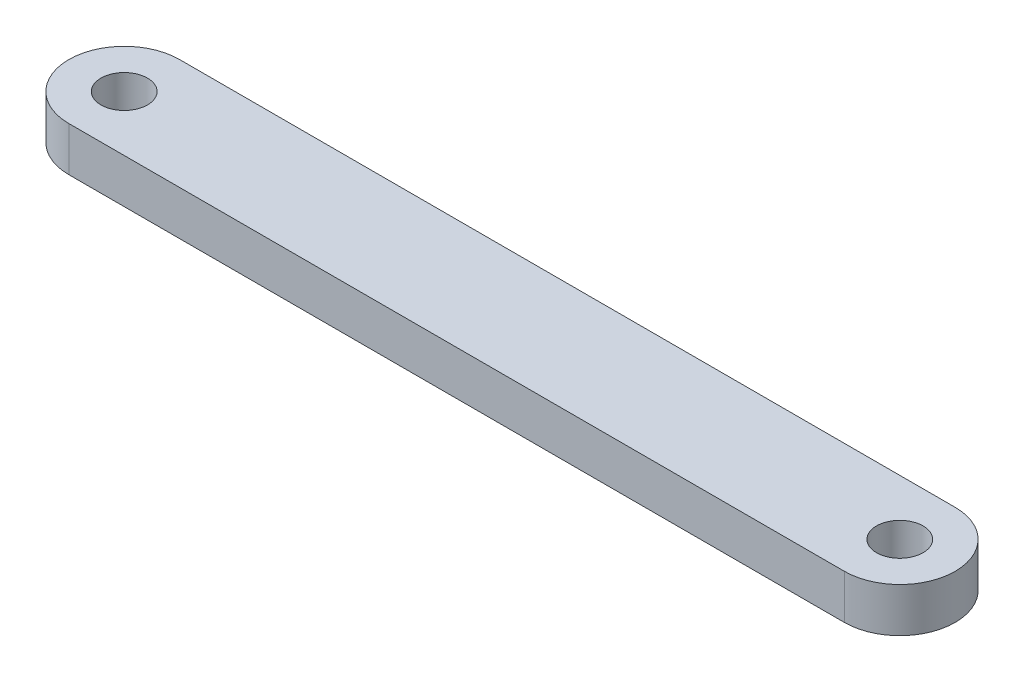
ISO-10303-21;
HEADER;
FILE_DESCRIPTION(('STEP AP214'),'2;1');
FILE_NAME('part.step','',(''),(''),'','','');
FILE_SCHEMA(('AUTOMOTIVE_DESIGN { 1 0 10303 214 1 1 1 1 }'));
ENDSEC;
DATA;
#1=APPLICATION_CONTEXT('core data for automotive mechanical design processes');
#2=APPLICATION_PROTOCOL_DEFINITION('international standard','automotive_design',2000,#1);
#3=PRODUCT_CONTEXT('',#1,'mechanical');
#4=PRODUCT('Part','Part','',(#3));
#5=PRODUCT_RELATED_PRODUCT_CATEGORY('part','',(#4));
#6=PRODUCT_DEFINITION_FORMATION('','',#4);
#7=PRODUCT_DEFINITION_CONTEXT('part definition',#1,'design');
#8=PRODUCT_DEFINITION('design','',#6,#7);
#9=PRODUCT_DEFINITION_SHAPE('','',#8);
#10=(LENGTH_UNIT() NAMED_UNIT(*) SI_UNIT(.MILLI.,.METRE.));
#11=(NAMED_UNIT(*) PLANE_ANGLE_UNIT() SI_UNIT($,.RADIAN.));
#12=(NAMED_UNIT(*) SI_UNIT($,.STERADIAN.) SOLID_ANGLE_UNIT());
#13=UNCERTAINTY_MEASURE_WITH_UNIT(LENGTH_MEASURE(1.E-05),#10,'distance_accuracy_value','');
#14=(GEOMETRIC_REPRESENTATION_CONTEXT(3) GLOBAL_UNCERTAINTY_ASSIGNED_CONTEXT((#13)) GLOBAL_UNIT_ASSIGNED_CONTEXT((#10,
#11,#12)) REPRESENTATION_CONTEXT('',''));
#15=CARTESIAN_POINT('',(0.,0.,0.));
#16=DIRECTION('',(0.,0.,1.));
#17=DIRECTION('',(1.,0.,0.));
#18=AXIS2_PLACEMENT_3D('',#15,#16,#17);
#19=CARTESIAN_POINT('',(0.,2.,0.));
#20=DIRECTION('',(0.,1.,0.));
#21=DIRECTION('',(0.,0.,1.));
#22=AXIS2_PLACEMENT_3D('',#19,#20,#21);
#23=PLANE('',#22);
#24=CARTESIAN_POINT('',(0.,2.,0.));
#25=DIRECTION('',(0.,1.,0.));
#26=DIRECTION('',(0.,0.,1.));
#27=AXIS2_PLACEMENT_3D('',#24,#25,#26);
#28=CIRCLE('',#27,1.05);
#29=CARTESIAN_POINT('',(0.,2.,1.05));
#30=VERTEX_POINT('',#29);
#31=EDGE_CURVE('E103',#30,#30,#28,.T.);
#32=ORIENTED_EDGE('',*,*,#31,.F.);
#33=EDGE_LOOP('',(#32));
#34=FACE_BOUND('',#33,.T.);
#35=CARTESIAN_POINT('',(0.,2.,0.));
#36=DIRECTION('',(0.,1.,0.));
#37=DIRECTION('',(0.,0.,1.));
#38=AXIS2_PLACEMENT_3D('',#35,#36,#37);
#39=CIRCLE('',#38,2.5);
#40=CARTESIAN_POINT('',(0.,2.,-2.5));
#41=VERTEX_POINT('',#40);
#42=CARTESIAN_POINT('',(0.,2.,2.5));
#43=VERTEX_POINT('',#42);
#44=EDGE_CURVE('E88',#41,#43,#39,.T.);
#45=ORIENTED_EDGE('',*,*,#44,.T.);
#46=DIRECTION('',(1.,0.,0.));
#47=VECTOR('',#46,1.);
#48=CARTESIAN_POINT('',(0.,2.,2.5));
#49=LINE('',#48,#47);
#50=CARTESIAN_POINT('',(35.,2.,2.5));
#51=VERTEX_POINT('',#50);
#52=EDGE_CURVE('E83',#43,#51,#49,.T.);
#53=ORIENTED_EDGE('',*,*,#52,.T.);
#54=CARTESIAN_POINT('',(35.,2.,0.));
#55=DIRECTION('',(0.,1.,0.));
#56=DIRECTION('',(0.,0.,1.));
#57=AXIS2_PLACEMENT_3D('',#54,#55,#56);
#58=CIRCLE('',#57,2.5);
#59=CARTESIAN_POINT('',(35.,2.,-2.5));
#60=VERTEX_POINT('',#59);
#61=EDGE_CURVE('E86',#51,#60,#58,.T.);
#62=ORIENTED_EDGE('',*,*,#61,.T.);
#63=DIRECTION('',(-1.,0.,0.));
#64=VECTOR('',#63,1.);
#65=CARTESIAN_POINT('',(0.,2.,-2.5));
#66=LINE('',#65,#64);
#67=EDGE_CURVE('E53',#60,#41,#66,.T.);
#68=ORIENTED_EDGE('',*,*,#67,.T.);
#69=EDGE_LOOP('',(#45,#53,#62,#68));
#70=FACE_BOUND('',#69,.T.);
#71=CARTESIAN_POINT('',(35.,2.,0.));
#72=DIRECTION('',(0.,1.,0.));
#73=DIRECTION('',(0.,0.,1.));
#74=AXIS2_PLACEMENT_3D('',#71,#72,#73);
#75=CIRCLE('',#74,1.04999999999999);
#76=CARTESIAN_POINT('',(35.,2.,1.04999999999999));
#77=VERTEX_POINT('',#76);
#78=EDGE_CURVE('E118',#77,#77,#75,.T.);
#79=ORIENTED_EDGE('',*,*,#78,.F.);
#80=EDGE_LOOP('',(#79));
#81=FACE_BOUND('',#80,.T.);
#82=ADVANCED_FACE('F36',(#34,#70,#81),#23,.T.);
#83=CARTESIAN_POINT('',(0.,0.,0.));
#84=DIRECTION('',(0.,1.,0.));
#85=DIRECTION('',(0.,0.,1.));
#86=AXIS2_PLACEMENT_3D('',#83,#84,#85);
#87=PLANE('',#86);
#88=CARTESIAN_POINT('',(0.,0.,0.));
#89=DIRECTION('',(0.,1.,0.));
#90=DIRECTION('',(0.,0.,1.));
#91=AXIS2_PLACEMENT_3D('',#88,#89,#90);
#92=CIRCLE('',#91,2.5);
#93=CARTESIAN_POINT('',(0.,0.,-2.5));
#94=VERTEX_POINT('',#93);
#95=CARTESIAN_POINT('',(0.,0.,2.5));
#96=VERTEX_POINT('',#95);
#97=EDGE_CURVE('E100',#94,#96,#92,.T.);
#98=ORIENTED_EDGE('',*,*,#97,.F.);
#99=DIRECTION('',(-1.,0.,0.));
#100=VECTOR('',#99,1.);
#101=CARTESIAN_POINT('',(0.,0.,-2.5));
#102=LINE('',#101,#100);
#103=CARTESIAN_POINT('',(35.,0.,-2.5));
#104=VERTEX_POINT('',#103);
#105=EDGE_CURVE('E76',#104,#94,#102,.T.);
#106=ORIENTED_EDGE('',*,*,#105,.F.);
#107=CARTESIAN_POINT('',(35.,0.,0.));
#108=DIRECTION('',(0.,1.,0.));
#109=DIRECTION('',(0.,0.,1.));
#110=AXIS2_PLACEMENT_3D('',#107,#108,#109);
#111=CIRCLE('',#110,2.5);
#112=CARTESIAN_POINT('',(35.,0.,2.5));
#113=VERTEX_POINT('',#112);
#114=EDGE_CURVE('E70',#113,#104,#111,.T.);
#115=ORIENTED_EDGE('',*,*,#114,.F.);
#116=DIRECTION('',(1.,0.,0.));
#117=VECTOR('',#116,1.);
#118=CARTESIAN_POINT('',(0.,0.,2.5));
#119=LINE('',#118,#117);
#120=EDGE_CURVE('E92',#96,#113,#119,.T.);
#121=ORIENTED_EDGE('',*,*,#120,.F.);
#122=EDGE_LOOP('',(#98,#106,#115,#121));
#123=FACE_BOUND('',#122,.T.);
#124=CARTESIAN_POINT('',(0.,0.,0.));
#125=DIRECTION('',(0.,1.,0.));
#126=DIRECTION('',(0.,0.,1.));
#127=AXIS2_PLACEMENT_3D('',#124,#125,#126);
#128=CIRCLE('',#127,1.05);
#129=CARTESIAN_POINT('',(0.,0.,1.05));
#130=VERTEX_POINT('',#129);
#131=EDGE_CURVE('E115',#130,#130,#128,.T.);
#132=ORIENTED_EDGE('',*,*,#131,.T.);
#133=EDGE_LOOP('',(#132));
#134=FACE_BOUND('',#133,.T.);
#135=CARTESIAN_POINT('',(35.,0.,0.));
#136=DIRECTION('',(0.,1.,0.));
#137=DIRECTION('',(0.,0.,1.));
#138=AXIS2_PLACEMENT_3D('',#135,#136,#137);
#139=CIRCLE('',#138,1.04999999999999);
#140=CARTESIAN_POINT('',(35.,0.,1.04999999999999));
#141=VERTEX_POINT('',#140);
#142=EDGE_CURVE('E121',#141,#141,#139,.T.);
#143=ORIENTED_EDGE('',*,*,#142,.T.);
#144=EDGE_LOOP('',(#143));
#145=FACE_BOUND('',#144,.T.);
#146=ADVANCED_FACE('F111',(#123,#134,#145),#87,.F.);
#147=CARTESIAN_POINT('',(0.,2.,0.));
#148=DIRECTION('',(0.,-1.,0.));
#149=DIRECTION('',(0.,0.,-1.));
#150=AXIS2_PLACEMENT_3D('',#147,#148,#149);
#151=CYLINDRICAL_SURFACE('',#150,2.5);
#152=ORIENTED_EDGE('',*,*,#97,.T.);
#153=DIRECTION('',(0.,-1.,0.));
#154=VECTOR('',#153,1.);
#155=CARTESIAN_POINT('',(0.,2.,2.5));
#156=LINE('',#155,#154);
#157=EDGE_CURVE('E11',#43,#96,#156,.T.);
#158=ORIENTED_EDGE('',*,*,#157,.F.);
#159=ORIENTED_EDGE('',*,*,#44,.F.);
#160=DIRECTION('',(0.,-1.,0.));
#161=VECTOR('',#160,1.);
#162=CARTESIAN_POINT('',(0.,2.,-2.5));
#163=LINE('',#162,#161);
#164=EDGE_CURVE('E96',#41,#94,#163,.T.);
#165=ORIENTED_EDGE('',*,*,#164,.T.);
#166=EDGE_LOOP('',(#152,#158,#159,#165));
#167=FACE_BOUND('',#166,.T.);
#168=ADVANCED_FACE('F38',(#167),#151,.T.);
#169=CARTESIAN_POINT('',(0.,2.,2.5));
#170=DIRECTION('',(0.,0.,-1.));
#171=DIRECTION('',(-1.,0.,0.));
#172=AXIS2_PLACEMENT_3D('',#169,#170,#171);
#173=PLANE('',#172);
#174=ORIENTED_EDGE('',*,*,#120,.T.);
#175=DIRECTION('',(0.,-1.,0.));
#176=VECTOR('',#175,1.);
#177=CARTESIAN_POINT('',(35.,2.,2.5));
#178=LINE('',#177,#176);
#179=EDGE_CURVE('E45',#51,#113,#178,.T.);
#180=ORIENTED_EDGE('',*,*,#179,.F.);
#181=ORIENTED_EDGE('',*,*,#52,.F.);
#182=ORIENTED_EDGE('',*,*,#157,.T.);
#183=EDGE_LOOP('',(#174,#180,#181,#182));
#184=FACE_BOUND('',#183,.T.);
#185=ADVANCED_FACE('F91',(#184),#173,.F.);
#186=CARTESIAN_POINT('',(35.,2.,0.));
#187=DIRECTION('',(0.,-1.,0.));
#188=DIRECTION('',(0.,0.,-1.));
#189=AXIS2_PLACEMENT_3D('',#186,#187,#188);
#190=CYLINDRICAL_SURFACE('',#189,2.5);
#191=ORIENTED_EDGE('',*,*,#114,.T.);
#192=DIRECTION('',(0.,-1.,0.));
#193=VECTOR('',#192,1.);
#194=CARTESIAN_POINT('',(35.,2.,-2.5));
#195=LINE('',#194,#193);
#196=EDGE_CURVE('E93',#60,#104,#195,.T.);
#197=ORIENTED_EDGE('',*,*,#196,.F.);
#198=ORIENTED_EDGE('',*,*,#61,.F.);
#199=ORIENTED_EDGE('',*,*,#179,.T.);
#200=EDGE_LOOP('',(#191,#197,#198,#199));
#201=FACE_BOUND('',#200,.T.);
#202=ADVANCED_FACE('F94',(#201),#190,.T.);
#203=CARTESIAN_POINT('',(0.,2.,-2.5));
#204=DIRECTION('',(0.,0.,1.));
#205=DIRECTION('',(1.,0.,0.));
#206=AXIS2_PLACEMENT_3D('',#203,#204,#205);
#207=PLANE('',#206);
#208=ORIENTED_EDGE('',*,*,#105,.T.);
#209=ORIENTED_EDGE('',*,*,#164,.F.);
#210=ORIENTED_EDGE('',*,*,#67,.F.);
#211=ORIENTED_EDGE('',*,*,#196,.T.);
#212=EDGE_LOOP('',(#208,#209,#210,#211));
#213=FACE_BOUND('',#212,.T.);
#214=ADVANCED_FACE('F108',(#213),#207,.F.);
#215=CARTESIAN_POINT('',(0.,2.,0.));
#216=DIRECTION('',(0.,-1.,0.));
#217=DIRECTION('',(0.,0.,-1.));
#218=AXIS2_PLACEMENT_3D('',#215,#216,#217);
#219=CYLINDRICAL_SURFACE('',#218,1.05);
#220=ORIENTED_EDGE('',*,*,#31,.T.);
#221=EDGE_LOOP('',(#220));
#222=FACE_BOUND('',#221,.T.);
#223=ORIENTED_EDGE('',*,*,#131,.F.);
#224=EDGE_LOOP('',(#223));
#225=FACE_BOUND('',#224,.T.);
#226=ADVANCED_FACE('F138',(#222,#225),#219,.F.);
#227=CARTESIAN_POINT('',(35.,2.,0.));
#228=DIRECTION('',(0.,-1.,0.));
#229=DIRECTION('',(0.,0.,-1.));
#230=AXIS2_PLACEMENT_3D('',#227,#228,#229);
#231=CYLINDRICAL_SURFACE('',#230,1.04999999999999);
#232=ORIENTED_EDGE('',*,*,#78,.T.);
#233=EDGE_LOOP('',(#232));
#234=FACE_BOUND('',#233,.T.);
#235=ORIENTED_EDGE('',*,*,#142,.F.);
#236=EDGE_LOOP('',(#235));
#237=FACE_BOUND('',#236,.T.);
#238=ADVANCED_FACE('F127',(#234,#237),#231,.F.);
#239=CLOSED_SHELL('',(#82,#146,#168,#185,#202,#214,#226,#238));
#240=MANIFOLD_SOLID_BREP('B2',#239);
#241=ADVANCED_BREP_SHAPE_REPRESENTATION('',(#18,#240),#14);
#242=SHAPE_DEFINITION_REPRESENTATION(#9,#241);
ENDSEC;
END-ISO-10303-21;
